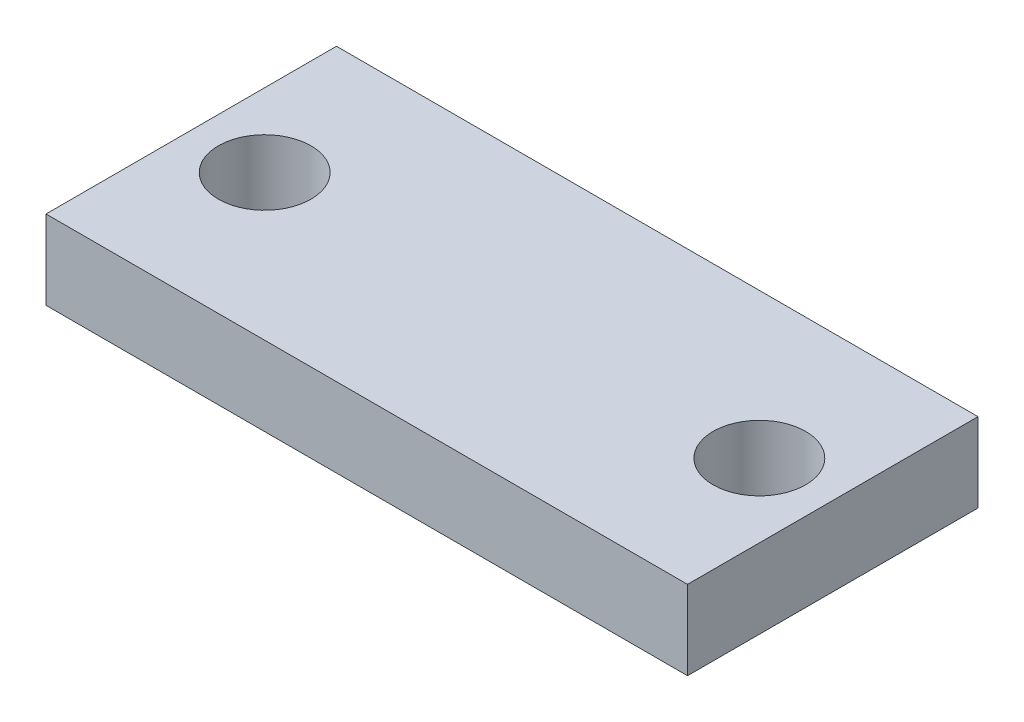
ISO-10303-21;
HEADER;
FILE_DESCRIPTION(('STEP AP214'),'2;1');
FILE_NAME('part.step','',(''),(''),'','','');
FILE_SCHEMA(('AUTOMOTIVE_DESIGN { 1 0 10303 214 1 1 1 1 }'));
ENDSEC;
DATA;
#1=APPLICATION_CONTEXT('core data for automotive mechanical design processes');
#2=APPLICATION_PROTOCOL_DEFINITION('international standard','automotive_design',2000,#1);
#3=PRODUCT_CONTEXT('',#1,'mechanical');
#4=PRODUCT('Part','Part','',(#3));
#5=PRODUCT_RELATED_PRODUCT_CATEGORY('part','',(#4));
#6=PRODUCT_DEFINITION_FORMATION('','',#4);
#7=PRODUCT_DEFINITION_CONTEXT('part definition',#1,'design');
#8=PRODUCT_DEFINITION('design','',#6,#7);
#9=PRODUCT_DEFINITION_SHAPE('','',#8);
#10=(LENGTH_UNIT() NAMED_UNIT(*) SI_UNIT(.MILLI.,.METRE.));
#11=(NAMED_UNIT(*) PLANE_ANGLE_UNIT() SI_UNIT($,.RADIAN.));
#12=(NAMED_UNIT(*) SI_UNIT($,.STERADIAN.) SOLID_ANGLE_UNIT());
#13=UNCERTAINTY_MEASURE_WITH_UNIT(LENGTH_MEASURE(1.E-05),#10,'distance_accuracy_value','');
#14=(GEOMETRIC_REPRESENTATION_CONTEXT(3) GLOBAL_UNCERTAINTY_ASSIGNED_CONTEXT((#13)) GLOBAL_UNIT_ASSIGNED_CONTEXT((#10,
#11,#12)) REPRESENTATION_CONTEXT('',''));
#15=CARTESIAN_POINT('',(0.,0.,0.));
#16=DIRECTION('',(0.,0.,1.));
#17=DIRECTION('',(1.,0.,0.));
#18=AXIS2_PLACEMENT_3D('',#15,#16,#17);
#19=CARTESIAN_POINT('',(16.21,4.,7.34));
#20=DIRECTION('',(-1.,0.,0.));
#21=DIRECTION('',(0.,0.,1.));
#22=AXIS2_PLACEMENT_3D('',#19,#20,#21);
#23=PLANE('',#22);
#24=DIRECTION('',(0.,0.,-1.));
#25=VECTOR('',#24,1.);
#26=CARTESIAN_POINT('',(16.21,0.,7.34));
#27=LINE('',#26,#25);
#28=CARTESIAN_POINT('',(16.21,0.,7.34));
#29=VERTEX_POINT('',#28);
#30=CARTESIAN_POINT('',(16.21,0.,-7.34));
#31=VERTEX_POINT('',#30);
#32=EDGE_CURVE('E99',#29,#31,#27,.T.);
#33=ORIENTED_EDGE('',*,*,#32,.T.);
#34=DIRECTION('',(0.,-1.,0.));
#35=VECTOR('',#34,1.);
#36=CARTESIAN_POINT('',(16.21,4.,-7.34));
#37=LINE('',#36,#35);
#38=CARTESIAN_POINT('',(16.21,4.,-7.34));
#39=VERTEX_POINT('',#38);
#40=EDGE_CURVE('E11',#39,#31,#37,.T.);
#41=ORIENTED_EDGE('',*,*,#40,.F.);
#42=DIRECTION('',(0.,0.,-1.));
#43=VECTOR('',#42,1.);
#44=CARTESIAN_POINT('',(16.21,4.,7.34));
#45=LINE('',#44,#43);
#46=CARTESIAN_POINT('',(16.21,4.,7.34));
#47=VERTEX_POINT('',#46);
#48=EDGE_CURVE('E87',#47,#39,#45,.T.);
#49=ORIENTED_EDGE('',*,*,#48,.F.);
#50=DIRECTION('',(0.,-1.,0.));
#51=VECTOR('',#50,1.);
#52=CARTESIAN_POINT('',(16.21,4.,7.34));
#53=LINE('',#52,#51);
#54=EDGE_CURVE('E95',#47,#29,#53,.T.);
#55=ORIENTED_EDGE('',*,*,#54,.T.);
#56=EDGE_LOOP('',(#33,#41,#49,#55));
#57=FACE_BOUND('',#56,.T.);
#58=ADVANCED_FACE('F36',(#57),#23,.F.);
#59=CARTESIAN_POINT('',(-16.21,4.,-7.34));
#60=DIRECTION('',(0.,0.,1.));
#61=DIRECTION('',(1.,0.,0.));
#62=AXIS2_PLACEMENT_3D('',#59,#60,#61);
#63=PLANE('',#62);
#64=DIRECTION('',(-1.,0.,0.));
#65=VECTOR('',#64,1.);
#66=CARTESIAN_POINT('',(-16.21,0.,-7.34));
#67=LINE('',#66,#65);
#68=CARTESIAN_POINT('',(-16.21,0.,-7.34));
#69=VERTEX_POINT('',#68);
#70=EDGE_CURVE('E91',#31,#69,#67,.T.);
#71=ORIENTED_EDGE('',*,*,#70,.T.);
#72=DIRECTION('',(0.,-1.,0.));
#73=VECTOR('',#72,1.);
#74=CARTESIAN_POINT('',(-16.21,4.,-7.34));
#75=LINE('',#74,#73);
#76=CARTESIAN_POINT('',(-16.21,4.,-7.34));
#77=VERTEX_POINT('',#76);
#78=EDGE_CURVE('E44',#77,#69,#75,.T.);
#79=ORIENTED_EDGE('',*,*,#78,.F.);
#80=DIRECTION('',(-1.,0.,0.));
#81=VECTOR('',#80,1.);
#82=CARTESIAN_POINT('',(-16.21,4.,-7.34));
#83=LINE('',#82,#81);
#84=EDGE_CURVE('E82',#39,#77,#83,.T.);
#85=ORIENTED_EDGE('',*,*,#84,.F.);
#86=ORIENTED_EDGE('',*,*,#40,.T.);
#87=EDGE_LOOP('',(#71,#79,#85,#86));
#88=FACE_BOUND('',#87,.T.);
#89=ADVANCED_FACE('F90',(#88),#63,.F.);
#90=CARTESIAN_POINT('',(-16.21,4.,7.34));
#91=DIRECTION('',(1.,0.,0.));
#92=DIRECTION('',(0.,0.,-1.));
#93=AXIS2_PLACEMENT_3D('',#90,#91,#92);
#94=PLANE('',#93);
#95=DIRECTION('',(0.,0.,1.));
#96=VECTOR('',#95,1.);
#97=CARTESIAN_POINT('',(-16.21,0.,7.34));
#98=LINE('',#97,#96);
#99=CARTESIAN_POINT('',(-16.21,0.,7.34));
#100=VERTEX_POINT('',#99);
#101=EDGE_CURVE('E69',#69,#100,#98,.T.);
#102=ORIENTED_EDGE('',*,*,#101,.T.);
#103=DIRECTION('',(0.,-1.,0.));
#104=VECTOR('',#103,1.);
#105=CARTESIAN_POINT('',(-16.21,4.,7.34));
#106=LINE('',#105,#104);
#107=CARTESIAN_POINT('',(-16.21,4.,7.34));
#108=VERTEX_POINT('',#107);
#109=EDGE_CURVE('E92',#108,#100,#106,.T.);
#110=ORIENTED_EDGE('',*,*,#109,.F.);
#111=DIRECTION('',(0.,0.,1.));
#112=VECTOR('',#111,1.);
#113=CARTESIAN_POINT('',(-16.21,4.,7.34));
#114=LINE('',#113,#112);
#115=EDGE_CURVE('E85',#77,#108,#114,.T.);
#116=ORIENTED_EDGE('',*,*,#115,.F.);
#117=ORIENTED_EDGE('',*,*,#78,.T.);
#118=EDGE_LOOP('',(#102,#110,#116,#117));
#119=FACE_BOUND('',#118,.T.);
#120=ADVANCED_FACE('F93',(#119),#94,.F.);
#121=CARTESIAN_POINT('',(-16.21,4.,7.34));
#122=DIRECTION('',(0.,0.,-1.));
#123=DIRECTION('',(-1.,0.,0.));
#124=AXIS2_PLACEMENT_3D('',#121,#122,#123);
#125=PLANE('',#124);
#126=DIRECTION('',(1.,0.,0.));
#127=VECTOR('',#126,1.);
#128=CARTESIAN_POINT('',(-16.21,0.,7.34));
#129=LINE('',#128,#127);
#130=EDGE_CURVE('E75',#100,#29,#129,.T.);
#131=ORIENTED_EDGE('',*,*,#130,.T.);
#132=ORIENTED_EDGE('',*,*,#54,.F.);
#133=DIRECTION('',(1.,0.,0.));
#134=VECTOR('',#133,1.);
#135=CARTESIAN_POINT('',(-16.21,4.,7.34));
#136=LINE('',#135,#134);
#137=EDGE_CURVE('E52',#108,#47,#136,.T.);
#138=ORIENTED_EDGE('',*,*,#137,.F.);
#139=ORIENTED_EDGE('',*,*,#109,.T.);
#140=EDGE_LOOP('',(#131,#132,#138,#139));
#141=FACE_BOUND('',#140,.T.);
#142=ADVANCED_FACE('F107',(#141),#125,.F.);
#143=CARTESIAN_POINT('',(0.,4.,0.));
#144=DIRECTION('',(0.,-1.,0.));
#145=DIRECTION('',(0.,0.,-1.));
#146=AXIS2_PLACEMENT_3D('',#143,#144,#145);
#147=PLANE('',#146);
#148=CARTESIAN_POINT('',(12.5,4.,0.));
#149=DIRECTION('',(0.,1.,0.));
#150=DIRECTION('',(0.,0.,1.));
#151=AXIS2_PLACEMENT_3D('',#148,#149,#150);
#152=CIRCLE('',#151,2.34);
#153=CARTESIAN_POINT('',(12.5,4.,2.34));
#154=VERTEX_POINT('',#153);
#155=EDGE_CURVE('E119',#154,#154,#152,.T.);
#156=ORIENTED_EDGE('',*,*,#155,.F.);
#157=EDGE_LOOP('',(#156));
#158=FACE_BOUND('',#157,.T.);
#159=CARTESIAN_POINT('',(-12.5,4.,0.));
#160=DIRECTION('',(0.,1.,0.));
#161=DIRECTION('',(0.,0.,1.));
#162=AXIS2_PLACEMENT_3D('',#159,#160,#161);
#163=CIRCLE('',#162,2.34);
#164=CARTESIAN_POINT('',(-12.5,4.,2.34));
#165=VERTEX_POINT('',#164);
#166=EDGE_CURVE('E113',#165,#165,#163,.T.);
#167=ORIENTED_EDGE('',*,*,#166,.F.);
#168=EDGE_LOOP('',(#167));
#169=FACE_BOUND('',#168,.T.);
#170=ORIENTED_EDGE('',*,*,#48,.T.);
#171=ORIENTED_EDGE('',*,*,#84,.T.);
#172=ORIENTED_EDGE('',*,*,#115,.T.);
#173=ORIENTED_EDGE('',*,*,#137,.T.);
#174=EDGE_LOOP('',(#170,#171,#172,#173));
#175=FACE_BOUND('',#174,.T.);
#176=ADVANCED_FACE('F83',(#158,#169,#175),#147,.F.);
#177=CARTESIAN_POINT('',(0.,0.,0.));
#178=DIRECTION('',(0.,-1.,0.));
#179=DIRECTION('',(0.,0.,-1.));
#180=AXIS2_PLACEMENT_3D('',#177,#178,#179);
#181=PLANE('',#180);
#182=CARTESIAN_POINT('',(12.5,0.,0.));
#183=DIRECTION('',(0.,1.,0.));
#184=DIRECTION('',(0.,0.,1.));
#185=AXIS2_PLACEMENT_3D('',#182,#183,#184);
#186=CIRCLE('',#185,2.34);
#187=CARTESIAN_POINT('',(12.5,0.,2.34));
#188=VERTEX_POINT('',#187);
#189=EDGE_CURVE('E102',#188,#188,#186,.T.);
#190=ORIENTED_EDGE('',*,*,#189,.T.);
#191=EDGE_LOOP('',(#190));
#192=FACE_BOUND('',#191,.T.);
#193=CARTESIAN_POINT('',(-12.5,0.,0.));
#194=DIRECTION('',(0.,1.,0.));
#195=DIRECTION('',(0.,0.,1.));
#196=AXIS2_PLACEMENT_3D('',#193,#194,#195);
#197=CIRCLE('',#196,2.34);
#198=CARTESIAN_POINT('',(-12.5,0.,2.34));
#199=VERTEX_POINT('',#198);
#200=EDGE_CURVE('E116',#199,#199,#197,.T.);
#201=ORIENTED_EDGE('',*,*,#200,.T.);
#202=EDGE_LOOP('',(#201));
#203=FACE_BOUND('',#202,.T.);
#204=ORIENTED_EDGE('',*,*,#32,.F.);
#205=ORIENTED_EDGE('',*,*,#130,.F.);
#206=ORIENTED_EDGE('',*,*,#101,.F.);
#207=ORIENTED_EDGE('',*,*,#70,.F.);
#208=EDGE_LOOP('',(#204,#205,#206,#207));
#209=FACE_BOUND('',#208,.T.);
#210=ADVANCED_FACE('F110',(#192,#203,#209),#181,.T.);
#211=CARTESIAN_POINT('',(-12.5,0.,0.));
#212=DIRECTION('',(0.,1.,0.));
#213=DIRECTION('',(0.,0.,1.));
#214=AXIS2_PLACEMENT_3D('',#211,#212,#213);
#215=CYLINDRICAL_SURFACE('',#214,2.34);
#216=ORIENTED_EDGE('',*,*,#200,.F.);
#217=EDGE_LOOP('',(#216));
#218=FACE_BOUND('',#217,.T.);
#219=ORIENTED_EDGE('',*,*,#166,.T.);
#220=EDGE_LOOP('',(#219));
#221=FACE_BOUND('',#220,.T.);
#222=ADVANCED_FACE('F130',(#218,#221),#215,.F.);
#223=CARTESIAN_POINT('',(12.5,0.,0.));
#224=DIRECTION('',(0.,1.,0.));
#225=DIRECTION('',(0.,0.,1.));
#226=AXIS2_PLACEMENT_3D('',#223,#224,#225);
#227=CYLINDRICAL_SURFACE('',#226,2.34);
#228=ORIENTED_EDGE('',*,*,#189,.F.);
#229=EDGE_LOOP('',(#228));
#230=FACE_BOUND('',#229,.T.);
#231=ORIENTED_EDGE('',*,*,#155,.T.);
#232=EDGE_LOOP('',(#231));
#233=FACE_BOUND('',#232,.T.);
#234=ADVANCED_FACE('F127',(#230,#233),#227,.F.);
#235=CLOSED_SHELL('',(#58,#89,#120,#142,#176,#210,#222,#234));
#236=MANIFOLD_SOLID_BREP('B2',#235);
#237=ADVANCED_BREP_SHAPE_REPRESENTATION('',(#18,#236),#14);
#238=SHAPE_DEFINITION_REPRESENTATION(#9,#237);
ENDSEC;
END-ISO-10303-21;
